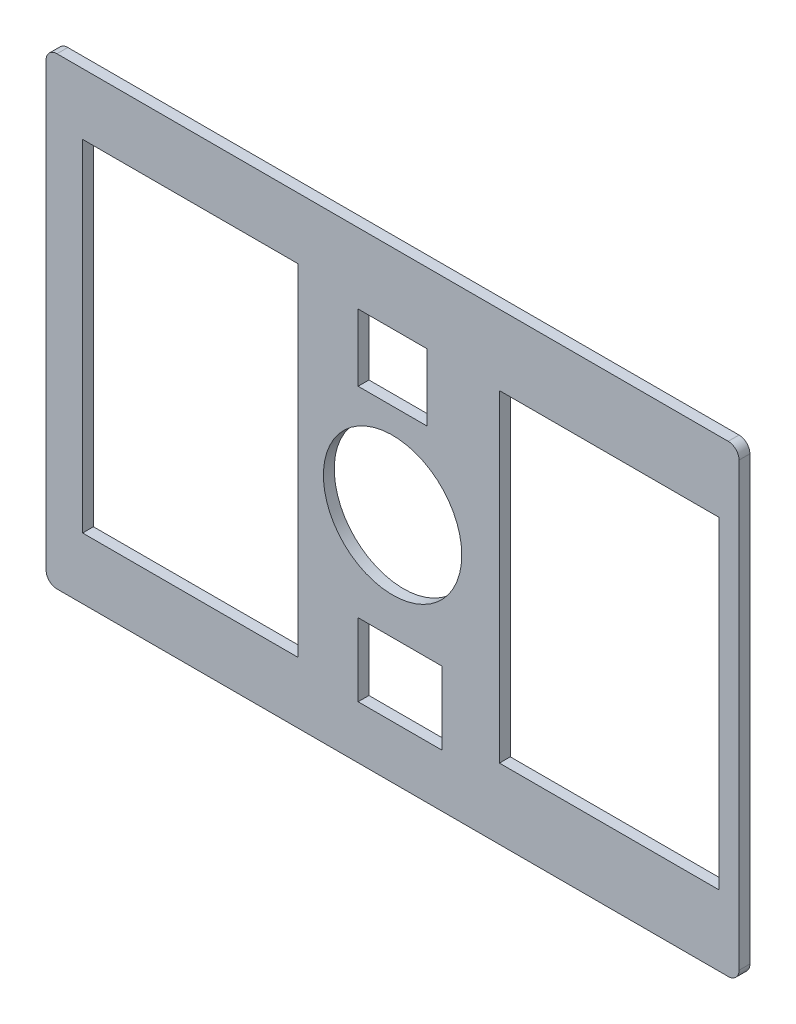
ISO-10303-21;
HEADER;
FILE_DESCRIPTION(('STEP AP214'),'2;1');
FILE_NAME('part.step','',(''),(''),'','','');
FILE_SCHEMA(('AUTOMOTIVE_DESIGN { 1 0 10303 214 1 1 1 1 }'));
ENDSEC;
DATA;
#1=APPLICATION_CONTEXT('core data for automotive mechanical design processes');
#2=APPLICATION_PROTOCOL_DEFINITION('international standard','automotive_design',2000,#1);
#3=PRODUCT_CONTEXT('',#1,'mechanical');
#4=PRODUCT('Part','Part','',(#3));
#5=PRODUCT_RELATED_PRODUCT_CATEGORY('part','',(#4));
#6=PRODUCT_DEFINITION_FORMATION('','',#4);
#7=PRODUCT_DEFINITION_CONTEXT('part definition',#1,'design');
#8=PRODUCT_DEFINITION('design','',#6,#7);
#9=PRODUCT_DEFINITION_SHAPE('','',#8);
#10=(LENGTH_UNIT() NAMED_UNIT(*) SI_UNIT(.MILLI.,.METRE.));
#11=(NAMED_UNIT(*) PLANE_ANGLE_UNIT() SI_UNIT($,.RADIAN.));
#12=(NAMED_UNIT(*) SI_UNIT($,.STERADIAN.) SOLID_ANGLE_UNIT());
#13=UNCERTAINTY_MEASURE_WITH_UNIT(LENGTH_MEASURE(1.E-05),#10,'distance_accuracy_value','');
#14=(GEOMETRIC_REPRESENTATION_CONTEXT(3) GLOBAL_UNCERTAINTY_ASSIGNED_CONTEXT((#13)) GLOBAL_UNIT_ASSIGNED_CONTEXT((#10,
#11,#12)) REPRESENTATION_CONTEXT('',''));
#15=CARTESIAN_POINT('',(0.,0.,0.));
#16=DIRECTION('',(0.,0.,1.));
#17=DIRECTION('',(1.,0.,0.));
#18=AXIS2_PLACEMENT_3D('',#15,#16,#17);
#19=CARTESIAN_POINT('',(-61.855,40.715,2.));
#20=DIRECTION('',(0.,0.,-1.));
#21=DIRECTION('',(-1.,0.,0.));
#22=AXIS2_PLACEMENT_3D('',#19,#20,#21);
#23=PLANE('',#22);
#24=DIRECTION('',(0.,-1.,0.));
#25=VECTOR('',#24,1.);
#26=CARTESIAN_POINT('',(-6.34975521554568,17.3943510106581,2.));
#27=LINE('',#26,#25);
#28=CARTESIAN_POINT('',(-6.34975521554568,29.7289235600392,2.));
#29=VERTEX_POINT('',#28);
#30=CARTESIAN_POINT('',(-6.34975521554568,17.3943510106581,2.));
#31=VERTEX_POINT('',#30);
#32=EDGE_CURVE('E230',#29,#31,#27,.T.);
#33=ORIENTED_EDGE('',*,*,#32,.F.);
#34=DIRECTION('',(-1.,0.,0.));
#35=VECTOR('',#34,1.);
#36=CARTESIAN_POINT('',(6.34975521554568,29.7289235600392,2.));
#37=LINE('',#36,#35);
#38=CARTESIAN_POINT('',(6.34975521554568,29.7289235600392,2.));
#39=VERTEX_POINT('',#38);
#40=EDGE_CURVE('E238',#39,#29,#37,.T.);
#41=ORIENTED_EDGE('',*,*,#40,.F.);
#42=DIRECTION('',(0.,1.,0.));
#43=VECTOR('',#42,1.);
#44=CARTESIAN_POINT('',(6.34975521554568,17.3943510106581,2.));
#45=LINE('',#44,#43);
#46=CARTESIAN_POINT('',(6.34975521554568,17.3943510106581,2.));
#47=VERTEX_POINT('',#46);
#48=EDGE_CURVE('E235',#47,#39,#45,.T.);
#49=ORIENTED_EDGE('',*,*,#48,.F.);
#50=DIRECTION('',(1.,0.,0.));
#51=VECTOR('',#50,1.);
#52=CARTESIAN_POINT('',(6.34975521554568,17.3943510106581,2.));
#53=LINE('',#52,#51);
#54=EDGE_CURVE('E232',#31,#47,#53,.T.);
#55=ORIENTED_EDGE('',*,*,#54,.F.);
#56=EDGE_LOOP('',(#33,#41,#49,#55));
#57=FACE_BOUND('',#56,.T.);
#58=DIRECTION('',(0.,-1.,0.));
#59=VECTOR('',#58,1.);
#60=CARTESIAN_POINT('',(-57.1289742230204,-31.4153182872247,2.));
#61=LINE('',#60,#59);
#62=CARTESIAN_POINT('',(-57.1289742230204,31.4153182872247,2.));
#63=VERTEX_POINT('',#62);
#64=CARTESIAN_POINT('',(-57.1289742230204,-31.4153182872247,2.));
#65=VERTEX_POINT('',#64);
#66=EDGE_CURVE('E292',#63,#65,#61,.T.);
#67=ORIENTED_EDGE('',*,*,#66,.F.);
#68=DIRECTION('',(-1.,0.,0.));
#69=VECTOR('',#68,1.);
#70=CARTESIAN_POINT('',(-17.4050095382062,31.4153182872247,2.));
#71=LINE('',#70,#69);
#72=CARTESIAN_POINT('',(-17.4050095382062,31.4153182872247,2.));
#73=VERTEX_POINT('',#72);
#74=EDGE_CURVE('E300',#73,#63,#71,.T.);
#75=ORIENTED_EDGE('',*,*,#74,.F.);
#76=DIRECTION('',(0.,1.,0.));
#77=VECTOR('',#76,1.);
#78=CARTESIAN_POINT('',(-17.4050095382062,-31.4153182872247,2.));
#79=LINE('',#78,#77);
#80=CARTESIAN_POINT('',(-17.4050095382062,-31.4153182872247,2.));
#81=VERTEX_POINT('',#80);
#82=EDGE_CURVE('E297',#81,#73,#79,.T.);
#83=ORIENTED_EDGE('',*,*,#82,.F.);
#84=DIRECTION('',(1.,0.,0.));
#85=VECTOR('',#84,1.);
#86=CARTESIAN_POINT('',(-17.4050095382062,-31.4153182872247,2.));
#87=LINE('',#86,#85);
#88=EDGE_CURVE('E294',#65,#81,#87,.T.);
#89=ORIENTED_EDGE('',*,*,#88,.F.);
#90=EDGE_LOOP('',(#67,#75,#83,#89));
#91=FACE_BOUND('',#90,.T.);
#92=CARTESIAN_POINT('',(-61.855,40.715,2.));
#93=DIRECTION('',(0.,0.,1.));
#94=DIRECTION('',(-1.,0.,0.));
#95=AXIS2_PLACEMENT_3D('',#92,#93,#94);
#96=CIRCLE('',#95,2.);
#97=CARTESIAN_POINT('',(-61.855,42.715,2.));
#98=VERTEX_POINT('',#97);
#99=CARTESIAN_POINT('',(-63.855,40.715,2.));
#100=VERTEX_POINT('',#99);
#101=EDGE_CURVE('E329',#98,#100,#96,.T.);
#102=ORIENTED_EDGE('',*,*,#101,.T.);
#103=DIRECTION('',(0.,-1.,0.));
#104=VECTOR('',#103,1.);
#105=CARTESIAN_POINT('',(-63.855,-40.715,2.));
#106=LINE('',#105,#104);
#107=CARTESIAN_POINT('',(-63.855,-40.715,2.));
#108=VERTEX_POINT('',#107);
#109=EDGE_CURVE('E332',#100,#108,#106,.T.);
#110=ORIENTED_EDGE('',*,*,#109,.T.);
#111=CARTESIAN_POINT('',(-61.855,-40.715,2.));
#112=DIRECTION('',(0.,0.,1.));
#113=DIRECTION('',(-1.,0.,0.));
#114=AXIS2_PLACEMENT_3D('',#111,#112,#113);
#115=CIRCLE('',#114,2.);
#116=CARTESIAN_POINT('',(-61.855,-42.715,2.));
#117=VERTEX_POINT('',#116);
#118=EDGE_CURVE('E335',#108,#117,#115,.T.);
#119=ORIENTED_EDGE('',*,*,#118,.T.);
#120=DIRECTION('',(1.,0.,0.));
#121=VECTOR('',#120,1.);
#122=CARTESIAN_POINT('',(61.855,-42.715,2.));
#123=LINE('',#122,#121);
#124=CARTESIAN_POINT('',(61.855,-42.715,2.));
#125=VERTEX_POINT('',#124);
#126=EDGE_CURVE('E337',#117,#125,#123,.T.);
#127=ORIENTED_EDGE('',*,*,#126,.T.);
#128=CARTESIAN_POINT('',(61.855,-40.715,2.));
#129=DIRECTION('',(0.,0.,1.));
#130=DIRECTION('',(1.,0.,0.));
#131=AXIS2_PLACEMENT_3D('',#128,#129,#130);
#132=CIRCLE('',#131,2.);
#133=CARTESIAN_POINT('',(63.855,-40.715,2.));
#134=VERTEX_POINT('',#133);
#135=EDGE_CURVE('E339',#125,#134,#132,.T.);
#136=ORIENTED_EDGE('',*,*,#135,.T.);
#137=DIRECTION('',(0.,1.,0.));
#138=VECTOR('',#137,1.);
#139=CARTESIAN_POINT('',(63.855,-40.715,2.));
#140=LINE('',#139,#138);
#141=CARTESIAN_POINT('',(63.855,40.715,2.));
#142=VERTEX_POINT('',#141);
#143=EDGE_CURVE('E341',#134,#142,#140,.T.);
#144=ORIENTED_EDGE('',*,*,#143,.T.);
#145=CARTESIAN_POINT('',(61.855,40.715,2.));
#146=DIRECTION('',(0.,0.,1.));
#147=DIRECTION('',(1.,0.,0.));
#148=AXIS2_PLACEMENT_3D('',#145,#146,#147);
#149=CIRCLE('',#148,2.);
#150=CARTESIAN_POINT('',(61.855,42.715,2.));
#151=VERTEX_POINT('',#150);
#152=EDGE_CURVE('E343',#142,#151,#149,.T.);
#153=ORIENTED_EDGE('',*,*,#152,.T.);
#154=DIRECTION('',(-1.,0.,0.));
#155=VECTOR('',#154,1.);
#156=CARTESIAN_POINT('',(61.855,42.715,2.));
#157=LINE('',#156,#155);
#158=EDGE_CURVE('E345',#151,#98,#157,.T.);
#159=ORIENTED_EDGE('',*,*,#158,.T.);
#160=EDGE_LOOP('',(#102,#110,#119,#127,#136,#144,#153,#159));
#161=FACE_BOUND('',#160,.T.);
#162=CARTESIAN_POINT('',(0.,0.,2.));
#163=DIRECTION('',(0.,0.,1.));
#164=DIRECTION('',(1.,0.,0.));
#165=AXIS2_PLACEMENT_3D('',#162,#163,#164);
#166=CIRCLE('',#165,12.75);
#167=CARTESIAN_POINT('',(12.75,0.,2.));
#168=VERTEX_POINT('',#167);
#169=EDGE_CURVE('E323',#168,#168,#166,.T.);
#170=ORIENTED_EDGE('',*,*,#169,.F.);
#171=EDGE_LOOP('',(#170));
#172=FACE_BOUND('',#171,.T.);
#173=DIRECTION('',(0.,-1.,0.));
#174=VECTOR('',#173,1.);
#175=CARTESIAN_POINT('',(19.6956744598749,-29.7289235600393,2.));
#176=LINE('',#175,#174);
#177=CARTESIAN_POINT('',(19.6956744598749,29.7289235600392,2.));
#178=VERTEX_POINT('',#177);
#179=CARTESIAN_POINT('',(19.6956744598749,-29.7289235600393,2.));
#180=VERTEX_POINT('',#179);
#181=EDGE_CURVE('E261',#178,#180,#176,.T.);
#182=ORIENTED_EDGE('',*,*,#181,.F.);
#183=DIRECTION('',(-1.,0.,0.));
#184=VECTOR('',#183,1.);
#185=CARTESIAN_POINT('',(60.1691479123272,29.7289235600392,2.));
#186=LINE('',#185,#184);
#187=CARTESIAN_POINT('',(60.1691479123272,29.7289235600392,2.));
#188=VERTEX_POINT('',#187);
#189=EDGE_CURVE('E269',#188,#178,#186,.T.);
#190=ORIENTED_EDGE('',*,*,#189,.F.);
#191=DIRECTION('',(0.,1.,0.));
#192=VECTOR('',#191,1.);
#193=CARTESIAN_POINT('',(60.1691479123272,-29.7289235600393,2.));
#194=LINE('',#193,#192);
#195=CARTESIAN_POINT('',(60.1691479123272,-29.7289235600393,2.));
#196=VERTEX_POINT('',#195);
#197=EDGE_CURVE('E266',#196,#188,#194,.T.);
#198=ORIENTED_EDGE('',*,*,#197,.F.);
#199=DIRECTION('',(1.,0.,0.));
#200=VECTOR('',#199,1.);
#201=CARTESIAN_POINT('',(60.1691479123272,-29.7289235600393,2.));
#202=LINE('',#201,#200);
#203=EDGE_CURVE('E263',#180,#196,#202,.T.);
#204=ORIENTED_EDGE('',*,*,#203,.F.);
#205=EDGE_LOOP('',(#182,#190,#198,#204));
#206=FACE_BOUND('',#205,.T.);
#207=DIRECTION('',(0.,-1.,0.));
#208=VECTOR('',#207,1.);
#209=CARTESIAN_POINT('',(-6.34975521554568,-32.9613141754538,2.));
#210=LINE('',#209,#208);
#211=CARTESIAN_POINT('',(-6.34975521554568,-19.5470758278872,2.));
#212=VERTEX_POINT('',#211);
#213=CARTESIAN_POINT('',(-6.34975521554568,-32.9613141754538,2.));
#214=VERTEX_POINT('',#213);
#215=EDGE_CURVE('E194',#212,#214,#210,.T.);
#216=ORIENTED_EDGE('',*,*,#215,.F.);
#217=DIRECTION('',(-1.,0.,0.));
#218=VECTOR('',#217,1.);
#219=CARTESIAN_POINT('',(9.07674979523479,-19.5470758278872,2.));
#220=LINE('',#219,#218);
#221=CARTESIAN_POINT('',(9.07674979523479,-19.5470758278872,2.));
#222=VERTEX_POINT('',#221);
#223=EDGE_CURVE('E216',#222,#212,#220,.T.);
#224=ORIENTED_EDGE('',*,*,#223,.F.);
#225=DIRECTION('',(0.,1.,0.));
#226=VECTOR('',#225,1.);
#227=CARTESIAN_POINT('',(9.07674979523479,-32.9613141754538,2.));
#228=LINE('',#227,#226);
#229=CARTESIAN_POINT('',(9.07674979523479,-32.9613141754538,2.));
#230=VERTEX_POINT('',#229);
#231=EDGE_CURVE('E214',#230,#222,#228,.T.);
#232=ORIENTED_EDGE('',*,*,#231,.F.);
#233=DIRECTION('',(1.,0.,0.));
#234=VECTOR('',#233,1.);
#235=CARTESIAN_POINT('',(9.07674979523479,-32.9613141754538,2.));
#236=LINE('',#235,#234);
#237=EDGE_CURVE('E202',#214,#230,#236,.T.);
#238=ORIENTED_EDGE('',*,*,#237,.F.);
#239=EDGE_LOOP('',(#216,#224,#232,#238));
#240=FACE_BOUND('',#239,.T.);
#241=ADVANCED_FACE('F33',(#57,#91,#161,#172,#206,#240),#23,.F.);
#242=CARTESIAN_POINT('',(-61.855,40.715,0.));
#243=DIRECTION('',(0.,0.,-1.));
#244=DIRECTION('',(-1.,0.,0.));
#245=AXIS2_PLACEMENT_3D('',#242,#243,#244);
#246=PLANE('',#245);
#247=CARTESIAN_POINT('',(-61.855,40.715,0.));
#248=DIRECTION('',(0.,0.,1.));
#249=DIRECTION('',(-1.,0.,0.));
#250=AXIS2_PLACEMENT_3D('',#247,#248,#249);
#251=CIRCLE('',#250,2.);
#252=CARTESIAN_POINT('',(-61.855,42.715,0.));
#253=VERTEX_POINT('',#252);
#254=CARTESIAN_POINT('',(-63.855,40.715,0.));
#255=VERTEX_POINT('',#254);
#256=EDGE_CURVE('E326',#253,#255,#251,.T.);
#257=ORIENTED_EDGE('',*,*,#256,.F.);
#258=DIRECTION('',(-1.,0.,0.));
#259=VECTOR('',#258,1.);
#260=CARTESIAN_POINT('',(61.855,42.715,0.));
#261=LINE('',#260,#259);
#262=CARTESIAN_POINT('',(61.855,42.715,0.));
#263=VERTEX_POINT('',#262);
#264=EDGE_CURVE('E333',#263,#253,#261,.T.);
#265=ORIENTED_EDGE('',*,*,#264,.F.);
#266=CARTESIAN_POINT('',(61.855,40.715,0.));
#267=DIRECTION('',(0.,0.,1.));
#268=DIRECTION('',(1.,0.,0.));
#269=AXIS2_PLACEMENT_3D('',#266,#267,#268);
#270=CIRCLE('',#269,2.);
#271=CARTESIAN_POINT('',(63.855,40.715,0.));
#272=VERTEX_POINT('',#271);
#273=EDGE_CURVE('E360',#272,#263,#270,.T.);
#274=ORIENTED_EDGE('',*,*,#273,.F.);
#275=DIRECTION('',(0.,1.,0.));
#276=VECTOR('',#275,1.);
#277=CARTESIAN_POINT('',(63.855,-40.715,0.));
#278=LINE('',#277,#276);
#279=CARTESIAN_POINT('',(63.855,-40.715,0.));
#280=VERTEX_POINT('',#279);
#281=EDGE_CURVE('E358',#280,#272,#278,.T.);
#282=ORIENTED_EDGE('',*,*,#281,.F.);
#283=CARTESIAN_POINT('',(61.855,-40.715,0.));
#284=DIRECTION('',(0.,0.,1.));
#285=DIRECTION('',(1.,0.,0.));
#286=AXIS2_PLACEMENT_3D('',#283,#284,#285);
#287=CIRCLE('',#286,2.);
#288=CARTESIAN_POINT('',(61.855,-42.715,0.));
#289=VERTEX_POINT('',#288);
#290=EDGE_CURVE('E356',#289,#280,#287,.T.);
#291=ORIENTED_EDGE('',*,*,#290,.F.);
#292=DIRECTION('',(1.,0.,0.));
#293=VECTOR('',#292,1.);
#294=CARTESIAN_POINT('',(61.855,-42.715,0.));
#295=LINE('',#294,#293);
#296=CARTESIAN_POINT('',(-61.855,-42.715,0.));
#297=VERTEX_POINT('',#296);
#298=EDGE_CURVE('E354',#297,#289,#295,.T.);
#299=ORIENTED_EDGE('',*,*,#298,.F.);
#300=CARTESIAN_POINT('',(-61.855,-40.715,0.));
#301=DIRECTION('',(0.,0.,1.));
#302=DIRECTION('',(-1.,0.,0.));
#303=AXIS2_PLACEMENT_3D('',#300,#301,#302);
#304=CIRCLE('',#303,2.);
#305=CARTESIAN_POINT('',(-63.855,-40.715,0.));
#306=VERTEX_POINT('',#305);
#307=EDGE_CURVE('E352',#306,#297,#304,.T.);
#308=ORIENTED_EDGE('',*,*,#307,.F.);
#309=DIRECTION('',(0.,-1.,0.));
#310=VECTOR('',#309,1.);
#311=CARTESIAN_POINT('',(-63.855,-40.715,0.));
#312=LINE('',#311,#310);
#313=EDGE_CURVE('E350',#255,#306,#312,.T.);
#314=ORIENTED_EDGE('',*,*,#313,.F.);
#315=EDGE_LOOP('',(#257,#265,#274,#282,#291,#299,#308,#314));
#316=FACE_BOUND('',#315,.T.);
#317=CARTESIAN_POINT('',(0.,0.,0.));
#318=DIRECTION('',(0.,0.,1.));
#319=DIRECTION('',(1.,0.,0.));
#320=AXIS2_PLACEMENT_3D('',#317,#318,#319);
#321=CIRCLE('',#320,12.75);
#322=CARTESIAN_POINT('',(12.75,0.,0.));
#323=VERTEX_POINT('',#322);
#324=EDGE_CURVE('E322',#323,#323,#321,.T.);
#325=ORIENTED_EDGE('',*,*,#324,.T.);
#326=EDGE_LOOP('',(#325));
#327=FACE_BOUND('',#326,.T.);
#328=DIRECTION('',(-1.,0.,0.));
#329=VECTOR('',#328,1.);
#330=CARTESIAN_POINT('',(-17.4050095382062,31.4153182872247,0.));
#331=LINE('',#330,#329);
#332=CARTESIAN_POINT('',(-17.4050095382062,31.4153182872247,0.));
#333=VERTEX_POINT('',#332);
#334=CARTESIAN_POINT('',(-57.1289742230204,31.4153182872247,0.));
#335=VERTEX_POINT('',#334);
#336=EDGE_CURVE('E295',#333,#335,#331,.T.);
#337=ORIENTED_EDGE('',*,*,#336,.T.);
#338=DIRECTION('',(0.,-1.,0.));
#339=VECTOR('',#338,1.);
#340=CARTESIAN_POINT('',(-57.1289742230204,-31.4153182872247,0.));
#341=LINE('',#340,#339);
#342=CARTESIAN_POINT('',(-57.1289742230204,-31.4153182872247,0.));
#343=VERTEX_POINT('',#342);
#344=EDGE_CURVE('E291',#335,#343,#341,.T.);
#345=ORIENTED_EDGE('',*,*,#344,.T.);
#346=DIRECTION('',(1.,0.,0.));
#347=VECTOR('',#346,1.);
#348=CARTESIAN_POINT('',(-17.4050095382062,-31.4153182872247,0.));
#349=LINE('',#348,#347);
#350=CARTESIAN_POINT('',(-17.4050095382062,-31.4153182872247,0.));
#351=VERTEX_POINT('',#350);
#352=EDGE_CURVE('E305',#343,#351,#349,.T.);
#353=ORIENTED_EDGE('',*,*,#352,.T.);
#354=DIRECTION('',(0.,1.,0.));
#355=VECTOR('',#354,1.);
#356=CARTESIAN_POINT('',(-17.4050095382062,-31.4153182872247,0.));
#357=LINE('',#356,#355);
#358=EDGE_CURVE('E308',#351,#333,#357,.T.);
#359=ORIENTED_EDGE('',*,*,#358,.T.);
#360=EDGE_LOOP('',(#337,#345,#353,#359));
#361=FACE_BOUND('',#360,.T.);
#362=DIRECTION('',(-1.,0.,0.));
#363=VECTOR('',#362,1.);
#364=CARTESIAN_POINT('',(60.1691479123272,29.7289235600392,0.));
#365=LINE('',#364,#363);
#366=CARTESIAN_POINT('',(60.1691479123272,29.7289235600392,0.));
#367=VERTEX_POINT('',#366);
#368=CARTESIAN_POINT('',(19.6956744598749,29.7289235600392,0.));
#369=VERTEX_POINT('',#368);
#370=EDGE_CURVE('E264',#367,#369,#365,.T.);
#371=ORIENTED_EDGE('',*,*,#370,.T.);
#372=DIRECTION('',(0.,-1.,0.));
#373=VECTOR('',#372,1.);
#374=CARTESIAN_POINT('',(19.6956744598749,-29.7289235600393,0.));
#375=LINE('',#374,#373);
#376=CARTESIAN_POINT('',(19.6956744598749,-29.7289235600393,0.));
#377=VERTEX_POINT('',#376);
#378=EDGE_CURVE('E260',#369,#377,#375,.T.);
#379=ORIENTED_EDGE('',*,*,#378,.T.);
#380=DIRECTION('',(1.,0.,0.));
#381=VECTOR('',#380,1.);
#382=CARTESIAN_POINT('',(60.1691479123272,-29.7289235600393,0.));
#383=LINE('',#382,#381);
#384=CARTESIAN_POINT('',(60.1691479123272,-29.7289235600393,0.));
#385=VERTEX_POINT('',#384);
#386=EDGE_CURVE('E274',#377,#385,#383,.T.);
#387=ORIENTED_EDGE('',*,*,#386,.T.);
#388=DIRECTION('',(0.,1.,0.));
#389=VECTOR('',#388,1.);
#390=CARTESIAN_POINT('',(60.1691479123272,-29.7289235600393,0.));
#391=LINE('',#390,#389);
#392=EDGE_CURVE('E277',#385,#367,#391,.T.);
#393=ORIENTED_EDGE('',*,*,#392,.T.);
#394=EDGE_LOOP('',(#371,#379,#387,#393));
#395=FACE_BOUND('',#394,.T.);
#396=DIRECTION('',(-1.,0.,0.));
#397=VECTOR('',#396,1.);
#398=CARTESIAN_POINT('',(6.34975521554568,29.7289235600392,0.));
#399=LINE('',#398,#397);
#400=CARTESIAN_POINT('',(6.34975521554568,29.7289235600392,0.));
#401=VERTEX_POINT('',#400);
#402=CARTESIAN_POINT('',(-6.34975521554568,29.7289235600392,0.));
#403=VERTEX_POINT('',#402);
#404=EDGE_CURVE('E233',#401,#403,#399,.T.);
#405=ORIENTED_EDGE('',*,*,#404,.T.);
#406=DIRECTION('',(0.,-1.,0.));
#407=VECTOR('',#406,1.);
#408=CARTESIAN_POINT('',(-6.34975521554568,17.3943510106581,0.));
#409=LINE('',#408,#407);
#410=CARTESIAN_POINT('',(-6.34975521554568,17.3943510106581,0.));
#411=VERTEX_POINT('',#410);
#412=EDGE_CURVE('E210',#403,#411,#409,.T.);
#413=ORIENTED_EDGE('',*,*,#412,.T.);
#414=DIRECTION('',(1.,0.,0.));
#415=VECTOR('',#414,1.);
#416=CARTESIAN_POINT('',(6.34975521554568,17.3943510106581,0.));
#417=LINE('',#416,#415);
#418=CARTESIAN_POINT('',(6.34975521554568,17.3943510106581,0.));
#419=VERTEX_POINT('',#418);
#420=EDGE_CURVE('E243',#411,#419,#417,.T.);
#421=ORIENTED_EDGE('',*,*,#420,.T.);
#422=DIRECTION('',(0.,1.,0.));
#423=VECTOR('',#422,1.);
#424=CARTESIAN_POINT('',(6.34975521554568,17.3943510106581,0.));
#425=LINE('',#424,#423);
#426=EDGE_CURVE('E246',#419,#401,#425,.T.);
#427=ORIENTED_EDGE('',*,*,#426,.T.);
#428=EDGE_LOOP('',(#405,#413,#421,#427));
#429=FACE_BOUND('',#428,.T.);
#430=DIRECTION('',(-1.,0.,0.));
#431=VECTOR('',#430,1.);
#432=CARTESIAN_POINT('',(9.07674979523479,-19.5470758278872,0.));
#433=LINE('',#432,#431);
#434=CARTESIAN_POINT('',(9.07674979523479,-19.5470758278872,0.));
#435=VERTEX_POINT('',#434);
#436=CARTESIAN_POINT('',(-6.34975521554568,-19.5470758278872,0.));
#437=VERTEX_POINT('',#436);
#438=EDGE_CURVE('E203',#435,#437,#433,.T.);
#439=ORIENTED_EDGE('',*,*,#438,.T.);
#440=DIRECTION('',(0.,-1.,0.));
#441=VECTOR('',#440,1.);
#442=CARTESIAN_POINT('',(-6.34975521554568,-32.9613141754538,0.));
#443=LINE('',#442,#441);
#444=CARTESIAN_POINT('',(-6.34975521554568,-32.9613141754538,0.));
#445=VERTEX_POINT('',#444);
#446=EDGE_CURVE('E56',#437,#445,#443,.T.);
#447=ORIENTED_EDGE('',*,*,#446,.T.);
#448=DIRECTION('',(1.,0.,0.));
#449=VECTOR('',#448,1.);
#450=CARTESIAN_POINT('',(9.07674979523479,-32.9613141754538,0.));
#451=LINE('',#450,#449);
#452=CARTESIAN_POINT('',(9.07674979523479,-32.9613141754538,0.));
#453=VERTEX_POINT('',#452);
#454=EDGE_CURVE('E209',#445,#453,#451,.T.);
#455=ORIENTED_EDGE('',*,*,#454,.T.);
#456=DIRECTION('',(0.,1.,0.));
#457=VECTOR('',#456,1.);
#458=CARTESIAN_POINT('',(9.07674979523479,-32.9613141754538,0.));
#459=LINE('',#458,#457);
#460=EDGE_CURVE('E222',#453,#435,#459,.T.);
#461=ORIENTED_EDGE('',*,*,#460,.T.);
#462=EDGE_LOOP('',(#439,#447,#455,#461));
#463=FACE_BOUND('',#462,.T.);
#464=ADVANCED_FACE('F390',(#316,#327,#361,#395,#429,#463),#246,.T.);
#465=CARTESIAN_POINT('',(-61.855,40.715,2.));
#466=DIRECTION('',(0.,0.,-1.));
#467=DIRECTION('',(-1.,0.,0.));
#468=AXIS2_PLACEMENT_3D('',#465,#466,#467);
#469=CYLINDRICAL_SURFACE('',#468,2.);
#470=ORIENTED_EDGE('',*,*,#256,.T.);
#471=DIRECTION('',(0.,0.,-1.));
#472=VECTOR('',#471,1.);
#473=CARTESIAN_POINT('',(-63.855,40.715,2.));
#474=LINE('',#473,#472);
#475=EDGE_CURVE('E11',#100,#255,#474,.T.);
#476=ORIENTED_EDGE('',*,*,#475,.F.);
#477=ORIENTED_EDGE('',*,*,#101,.F.);
#478=DIRECTION('',(0.,0.,-1.));
#479=VECTOR('',#478,1.);
#480=CARTESIAN_POINT('',(-61.855,42.715,2.));
#481=LINE('',#480,#479);
#482=EDGE_CURVE('E347',#98,#253,#481,.T.);
#483=ORIENTED_EDGE('',*,*,#482,.T.);
#484=EDGE_LOOP('',(#470,#476,#477,#483));
#485=FACE_BOUND('',#484,.T.);
#486=ADVANCED_FACE('F35',(#485),#469,.T.);
#487=CARTESIAN_POINT('',(-63.855,-40.715,2.));
#488=DIRECTION('',(1.,0.,0.));
#489=DIRECTION('',(0.,0.,-1.));
#490=AXIS2_PLACEMENT_3D('',#487,#488,#489);
#491=PLANE('',#490);
#492=ORIENTED_EDGE('',*,*,#313,.T.);
#493=DIRECTION('',(0.,0.,-1.));
#494=VECTOR('',#493,1.);
#495=CARTESIAN_POINT('',(-63.855,-40.715,2.));
#496=LINE('',#495,#494);
#497=EDGE_CURVE('E41',#108,#306,#496,.T.);
#498=ORIENTED_EDGE('',*,*,#497,.F.);
#499=ORIENTED_EDGE('',*,*,#109,.F.);
#500=ORIENTED_EDGE('',*,*,#475,.T.);
#501=EDGE_LOOP('',(#492,#498,#499,#500));
#502=FACE_BOUND('',#501,.T.);
#503=ADVANCED_FACE('F408',(#502),#491,.F.);
#504=CARTESIAN_POINT('',(-61.855,-40.715,2.));
#505=DIRECTION('',(0.,0.,-1.));
#506=DIRECTION('',(-1.,0.,0.));
#507=AXIS2_PLACEMENT_3D('',#504,#505,#506);
#508=CYLINDRICAL_SURFACE('',#507,2.);
#509=ORIENTED_EDGE('',*,*,#307,.T.);
#510=DIRECTION('',(0.,0.,-1.));
#511=VECTOR('',#510,1.);
#512=CARTESIAN_POINT('',(-61.855,-42.715,2.));
#513=LINE('',#512,#511);
#514=EDGE_CURVE('E377',#117,#297,#513,.T.);
#515=ORIENTED_EDGE('',*,*,#514,.F.);
#516=ORIENTED_EDGE('',*,*,#118,.F.);
#517=ORIENTED_EDGE('',*,*,#497,.T.);
#518=EDGE_LOOP('',(#509,#515,#516,#517));
#519=FACE_BOUND('',#518,.T.);
#520=ADVANCED_FACE('F384',(#519),#508,.T.);
#521=CARTESIAN_POINT('',(61.855,-42.715,2.));
#522=DIRECTION('',(0.,1.,0.));
#523=DIRECTION('',(0.,0.,1.));
#524=AXIS2_PLACEMENT_3D('',#521,#522,#523);
#525=PLANE('',#524);
#526=ORIENTED_EDGE('',*,*,#298,.T.);
#527=DIRECTION('',(0.,0.,-1.));
#528=VECTOR('',#527,1.);
#529=CARTESIAN_POINT('',(61.855,-42.715,2.));
#530=LINE('',#529,#528);
#531=EDGE_CURVE('E374',#125,#289,#530,.T.);
#532=ORIENTED_EDGE('',*,*,#531,.F.);
#533=ORIENTED_EDGE('',*,*,#126,.F.);
#534=ORIENTED_EDGE('',*,*,#514,.T.);
#535=EDGE_LOOP('',(#526,#532,#533,#534));
#536=FACE_BOUND('',#535,.T.);
#537=ADVANCED_FACE('F396',(#536),#525,.F.);
#538=CARTESIAN_POINT('',(61.855,-40.715,2.));
#539=DIRECTION('',(0.,0.,-1.));
#540=DIRECTION('',(-1.,0.,0.));
#541=AXIS2_PLACEMENT_3D('',#538,#539,#540);
#542=CYLINDRICAL_SURFACE('',#541,2.);
#543=ORIENTED_EDGE('',*,*,#290,.T.);
#544=DIRECTION('',(0.,0.,-1.));
#545=VECTOR('',#544,1.);
#546=CARTESIAN_POINT('',(63.855,-40.715,2.));
#547=LINE('',#546,#545);
#548=EDGE_CURVE('E371',#134,#280,#547,.T.);
#549=ORIENTED_EDGE('',*,*,#548,.F.);
#550=ORIENTED_EDGE('',*,*,#135,.F.);
#551=ORIENTED_EDGE('',*,*,#531,.T.);
#552=EDGE_LOOP('',(#543,#549,#550,#551));
#553=FACE_BOUND('',#552,.T.);
#554=ADVANCED_FACE('F400',(#553),#542,.T.);
#555=CARTESIAN_POINT('',(63.855,-40.715,2.));
#556=DIRECTION('',(-1.,0.,0.));
#557=DIRECTION('',(0.,0.,1.));
#558=AXIS2_PLACEMENT_3D('',#555,#556,#557);
#559=PLANE('',#558);
#560=ORIENTED_EDGE('',*,*,#281,.T.);
#561=DIRECTION('',(0.,0.,-1.));
#562=VECTOR('',#561,1.);
#563=CARTESIAN_POINT('',(63.855,40.715,2.));
#564=LINE('',#563,#562);
#565=EDGE_CURVE('E368',#142,#272,#564,.T.);
#566=ORIENTED_EDGE('',*,*,#565,.F.);
#567=ORIENTED_EDGE('',*,*,#143,.F.);
#568=ORIENTED_EDGE('',*,*,#548,.T.);
#569=EDGE_LOOP('',(#560,#566,#567,#568));
#570=FACE_BOUND('',#569,.T.);
#571=ADVANCED_FACE('F421',(#570),#559,.F.);
#572=CARTESIAN_POINT('',(61.855,40.715,2.));
#573=DIRECTION('',(0.,0.,-1.));
#574=DIRECTION('',(-1.,0.,0.));
#575=AXIS2_PLACEMENT_3D('',#572,#573,#574);
#576=CYLINDRICAL_SURFACE('',#575,2.);
#577=ORIENTED_EDGE('',*,*,#273,.T.);
#578=DIRECTION('',(0.,0.,-1.));
#579=VECTOR('',#578,1.);
#580=CARTESIAN_POINT('',(61.855,42.715,2.));
#581=LINE('',#580,#579);
#582=EDGE_CURVE('E365',#151,#263,#581,.T.);
#583=ORIENTED_EDGE('',*,*,#582,.F.);
#584=ORIENTED_EDGE('',*,*,#152,.F.);
#585=ORIENTED_EDGE('',*,*,#565,.T.);
#586=EDGE_LOOP('',(#577,#583,#584,#585));
#587=FACE_BOUND('',#586,.T.);
#588=ADVANCED_FACE('F419',(#587),#576,.T.);
#589=CARTESIAN_POINT('',(61.855,42.715,2.));
#590=DIRECTION('',(0.,-1.,0.));
#591=DIRECTION('',(0.,0.,-1.));
#592=AXIS2_PLACEMENT_3D('',#589,#590,#591);
#593=PLANE('',#592);
#594=ORIENTED_EDGE('',*,*,#264,.T.);
#595=ORIENTED_EDGE('',*,*,#482,.F.);
#596=ORIENTED_EDGE('',*,*,#158,.F.);
#597=ORIENTED_EDGE('',*,*,#582,.T.);
#598=EDGE_LOOP('',(#594,#595,#596,#597));
#599=FACE_BOUND('',#598,.T.);
#600=ADVANCED_FACE('F414',(#599),#593,.F.);
#601=CARTESIAN_POINT('',(0.,0.,2.));
#602=DIRECTION('',(0.,0.,-1.));
#603=DIRECTION('',(-1.,0.,0.));
#604=AXIS2_PLACEMENT_3D('',#601,#602,#603);
#605=CYLINDRICAL_SURFACE('',#604,12.75);
#606=ORIENTED_EDGE('',*,*,#169,.T.);
#607=EDGE_LOOP('',(#606));
#608=FACE_BOUND('',#607,.T.);
#609=ORIENTED_EDGE('',*,*,#324,.F.);
#610=EDGE_LOOP('',(#609));
#611=FACE_BOUND('',#610,.T.);
#612=ADVANCED_FACE('F440',(#608,#611),#605,.F.);
#613=CARTESIAN_POINT('',(-57.1289742230204,-31.4153182872247,2.));
#614=DIRECTION('',(1.,0.,0.));
#615=DIRECTION('',(0.,0.,-1.));
#616=AXIS2_PLACEMENT_3D('',#613,#614,#615);
#617=PLANE('',#616);
#618=ORIENTED_EDGE('',*,*,#344,.F.);
#619=DIRECTION('',(0.,0.,-1.));
#620=VECTOR('',#619,1.);
#621=CARTESIAN_POINT('',(-57.1289742230204,31.4153182872247,2.));
#622=LINE('',#621,#620);
#623=EDGE_CURVE('E302',#63,#335,#622,.T.);
#624=ORIENTED_EDGE('',*,*,#623,.F.);
#625=ORIENTED_EDGE('',*,*,#66,.T.);
#626=DIRECTION('',(0.,0.,-1.));
#627=VECTOR('',#626,1.);
#628=CARTESIAN_POINT('',(-57.1289742230204,-31.4153182872247,2.));
#629=LINE('',#628,#627);
#630=EDGE_CURVE('E319',#65,#343,#629,.T.);
#631=ORIENTED_EDGE('',*,*,#630,.T.);
#632=EDGE_LOOP('',(#618,#624,#625,#631));
#633=FACE_BOUND('',#632,.T.);
#634=ADVANCED_FACE('F447',(#633),#617,.T.);
#635=CARTESIAN_POINT('',(-17.4050095382062,-31.4153182872247,2.));
#636=DIRECTION('',(0.,1.,0.));
#637=DIRECTION('',(0.,0.,1.));
#638=AXIS2_PLACEMENT_3D('',#635,#636,#637);
#639=PLANE('',#638);
#640=ORIENTED_EDGE('',*,*,#352,.F.);
#641=ORIENTED_EDGE('',*,*,#630,.F.);
#642=ORIENTED_EDGE('',*,*,#88,.T.);
#643=DIRECTION('',(0.,0.,-1.));
#644=VECTOR('',#643,1.);
#645=CARTESIAN_POINT('',(-17.4050095382062,-31.4153182872247,2.));
#646=LINE('',#645,#644);
#647=EDGE_CURVE('E317',#81,#351,#646,.T.);
#648=ORIENTED_EDGE('',*,*,#647,.T.);
#649=EDGE_LOOP('',(#640,#641,#642,#648));
#650=FACE_BOUND('',#649,.T.);
#651=ADVANCED_FACE('F452',(#650),#639,.T.);
#652=CARTESIAN_POINT('',(-17.4050095382062,-31.4153182872247,2.));
#653=DIRECTION('',(-1.,0.,0.));
#654=DIRECTION('',(0.,0.,1.));
#655=AXIS2_PLACEMENT_3D('',#652,#653,#654);
#656=PLANE('',#655);
#657=ORIENTED_EDGE('',*,*,#358,.F.);
#658=ORIENTED_EDGE('',*,*,#647,.F.);
#659=ORIENTED_EDGE('',*,*,#82,.T.);
#660=DIRECTION('',(0.,0.,-1.));
#661=VECTOR('',#660,1.);
#662=CARTESIAN_POINT('',(-17.4050095382062,31.4153182872247,2.));
#663=LINE('',#662,#661);
#664=EDGE_CURVE('E315',#73,#333,#663,.T.);
#665=ORIENTED_EDGE('',*,*,#664,.T.);
#666=EDGE_LOOP('',(#657,#658,#659,#665));
#667=FACE_BOUND('',#666,.T.);
#668=ADVANCED_FACE('F514',(#667),#656,.T.);
#669=CARTESIAN_POINT('',(-17.4050095382062,31.4153182872247,2.));
#670=DIRECTION('',(0.,-1.,0.));
#671=DIRECTION('',(0.,0.,-1.));
#672=AXIS2_PLACEMENT_3D('',#669,#670,#671);
#673=PLANE('',#672);
#674=ORIENTED_EDGE('',*,*,#336,.F.);
#675=ORIENTED_EDGE('',*,*,#664,.F.);
#676=ORIENTED_EDGE('',*,*,#74,.T.);
#677=ORIENTED_EDGE('',*,*,#623,.T.);
#678=EDGE_LOOP('',(#674,#675,#676,#677));
#679=FACE_BOUND('',#678,.T.);
#680=ADVANCED_FACE('F510',(#679),#673,.T.);
#681=CARTESIAN_POINT('',(19.6956744598749,-29.7289235600393,2.));
#682=DIRECTION('',(1.,0.,0.));
#683=DIRECTION('',(0.,0.,-1.));
#684=AXIS2_PLACEMENT_3D('',#681,#682,#683);
#685=PLANE('',#684);
#686=ORIENTED_EDGE('',*,*,#378,.F.);
#687=DIRECTION('',(0.,0.,-1.));
#688=VECTOR('',#687,1.);
#689=CARTESIAN_POINT('',(19.6956744598749,29.7289235600392,2.));
#690=LINE('',#689,#688);
#691=EDGE_CURVE('E271',#178,#369,#690,.T.);
#692=ORIENTED_EDGE('',*,*,#691,.F.);
#693=ORIENTED_EDGE('',*,*,#181,.T.);
#694=DIRECTION('',(0.,0.,-1.));
#695=VECTOR('',#694,1.);
#696=CARTESIAN_POINT('',(19.6956744598749,-29.7289235600393,2.));
#697=LINE('',#696,#695);
#698=EDGE_CURVE('E288',#180,#377,#697,.T.);
#699=ORIENTED_EDGE('',*,*,#698,.T.);
#700=EDGE_LOOP('',(#686,#692,#693,#699));
#701=FACE_BOUND('',#700,.T.);
#702=ADVANCED_FACE('F506',(#701),#685,.T.);
#703=CARTESIAN_POINT('',(60.1691479123272,-29.7289235600393,2.));
#704=DIRECTION('',(0.,1.,0.));
#705=DIRECTION('',(0.,0.,1.));
#706=AXIS2_PLACEMENT_3D('',#703,#704,#705);
#707=PLANE('',#706);
#708=ORIENTED_EDGE('',*,*,#386,.F.);
#709=ORIENTED_EDGE('',*,*,#698,.F.);
#710=ORIENTED_EDGE('',*,*,#203,.T.);
#711=DIRECTION('',(0.,0.,-1.));
#712=VECTOR('',#711,1.);
#713=CARTESIAN_POINT('',(60.1691479123272,-29.7289235600393,2.));
#714=LINE('',#713,#712);
#715=EDGE_CURVE('E286',#196,#385,#714,.T.);
#716=ORIENTED_EDGE('',*,*,#715,.T.);
#717=EDGE_LOOP('',(#708,#709,#710,#716));
#718=FACE_BOUND('',#717,.T.);
#719=ADVANCED_FACE('F502',(#718),#707,.T.);
#720=CARTESIAN_POINT('',(60.1691479123272,-29.7289235600393,2.));
#721=DIRECTION('',(-1.,0.,0.));
#722=DIRECTION('',(0.,0.,1.));
#723=AXIS2_PLACEMENT_3D('',#720,#721,#722);
#724=PLANE('',#723);
#725=ORIENTED_EDGE('',*,*,#392,.F.);
#726=ORIENTED_EDGE('',*,*,#715,.F.);
#727=ORIENTED_EDGE('',*,*,#197,.T.);
#728=DIRECTION('',(0.,0.,-1.));
#729=VECTOR('',#728,1.);
#730=CARTESIAN_POINT('',(60.1691479123272,29.7289235600392,2.));
#731=LINE('',#730,#729);
#732=EDGE_CURVE('E284',#188,#367,#731,.T.);
#733=ORIENTED_EDGE('',*,*,#732,.T.);
#734=EDGE_LOOP('',(#725,#726,#727,#733));
#735=FACE_BOUND('',#734,.T.);
#736=ADVANCED_FACE('F498',(#735),#724,.T.);
#737=CARTESIAN_POINT('',(60.1691479123272,29.7289235600392,2.));
#738=DIRECTION('',(0.,-1.,0.));
#739=DIRECTION('',(0.,0.,-1.));
#740=AXIS2_PLACEMENT_3D('',#737,#738,#739);
#741=PLANE('',#740);
#742=ORIENTED_EDGE('',*,*,#370,.F.);
#743=ORIENTED_EDGE('',*,*,#732,.F.);
#744=ORIENTED_EDGE('',*,*,#189,.T.);
#745=ORIENTED_EDGE('',*,*,#691,.T.);
#746=EDGE_LOOP('',(#742,#743,#744,#745));
#747=FACE_BOUND('',#746,.T.);
#748=ADVANCED_FACE('F494',(#747),#741,.T.);
#749=CARTESIAN_POINT('',(-6.34975521554568,17.3943510106581,2.));
#750=DIRECTION('',(1.,0.,0.));
#751=DIRECTION('',(0.,0.,-1.));
#752=AXIS2_PLACEMENT_3D('',#749,#750,#751);
#753=PLANE('',#752);
#754=ORIENTED_EDGE('',*,*,#412,.F.);
#755=DIRECTION('',(0.,0.,-1.));
#756=VECTOR('',#755,1.);
#757=CARTESIAN_POINT('',(-6.34975521554568,29.7289235600392,2.));
#758=LINE('',#757,#756);
#759=EDGE_CURVE('E240',#29,#403,#758,.T.);
#760=ORIENTED_EDGE('',*,*,#759,.F.);
#761=ORIENTED_EDGE('',*,*,#32,.T.);
#762=DIRECTION('',(0.,0.,-1.));
#763=VECTOR('',#762,1.);
#764=CARTESIAN_POINT('',(-6.34975521554568,17.3943510106581,2.));
#765=LINE('',#764,#763);
#766=EDGE_CURVE('E257',#31,#411,#765,.T.);
#767=ORIENTED_EDGE('',*,*,#766,.T.);
#768=EDGE_LOOP('',(#754,#760,#761,#767));
#769=FACE_BOUND('',#768,.T.);
#770=ADVANCED_FACE('F490',(#769),#753,.T.);
#771=CARTESIAN_POINT('',(6.34975521554568,17.3943510106581,2.));
#772=DIRECTION('',(0.,1.,0.));
#773=DIRECTION('',(0.,0.,1.));
#774=AXIS2_PLACEMENT_3D('',#771,#772,#773);
#775=PLANE('',#774);
#776=ORIENTED_EDGE('',*,*,#420,.F.);
#777=ORIENTED_EDGE('',*,*,#766,.F.);
#778=ORIENTED_EDGE('',*,*,#54,.T.);
#779=DIRECTION('',(0.,0.,-1.));
#780=VECTOR('',#779,1.);
#781=CARTESIAN_POINT('',(6.34975521554568,17.3943510106581,2.));
#782=LINE('',#781,#780);
#783=EDGE_CURVE('E255',#47,#419,#782,.T.);
#784=ORIENTED_EDGE('',*,*,#783,.T.);
#785=EDGE_LOOP('',(#776,#777,#778,#784));
#786=FACE_BOUND('',#785,.T.);
#787=ADVANCED_FACE('F486',(#786),#775,.T.);
#788=CARTESIAN_POINT('',(6.34975521554568,17.3943510106581,2.));
#789=DIRECTION('',(-1.,0.,0.));
#790=DIRECTION('',(0.,0.,1.));
#791=AXIS2_PLACEMENT_3D('',#788,#789,#790);
#792=PLANE('',#791);
#793=ORIENTED_EDGE('',*,*,#426,.F.);
#794=ORIENTED_EDGE('',*,*,#783,.F.);
#795=ORIENTED_EDGE('',*,*,#48,.T.);
#796=DIRECTION('',(0.,0.,-1.));
#797=VECTOR('',#796,1.);
#798=CARTESIAN_POINT('',(6.34975521554568,29.7289235600392,2.));
#799=LINE('',#798,#797);
#800=EDGE_CURVE('E253',#39,#401,#799,.T.);
#801=ORIENTED_EDGE('',*,*,#800,.T.);
#802=EDGE_LOOP('',(#793,#794,#795,#801));
#803=FACE_BOUND('',#802,.T.);
#804=ADVANCED_FACE('F482',(#803),#792,.T.);
#805=CARTESIAN_POINT('',(6.34975521554568,29.7289235600392,2.));
#806=DIRECTION('',(0.,-1.,0.));
#807=DIRECTION('',(0.,0.,-1.));
#808=AXIS2_PLACEMENT_3D('',#805,#806,#807);
#809=PLANE('',#808);
#810=ORIENTED_EDGE('',*,*,#404,.F.);
#811=ORIENTED_EDGE('',*,*,#800,.F.);
#812=ORIENTED_EDGE('',*,*,#40,.T.);
#813=ORIENTED_EDGE('',*,*,#759,.T.);
#814=EDGE_LOOP('',(#810,#811,#812,#813));
#815=FACE_BOUND('',#814,.T.);
#816=ADVANCED_FACE('F479',(#815),#809,.T.);
#817=CARTESIAN_POINT('',(-6.34975521554568,-32.9613141754538,2.));
#818=DIRECTION('',(1.,0.,0.));
#819=DIRECTION('',(0.,0.,-1.));
#820=AXIS2_PLACEMENT_3D('',#817,#818,#819);
#821=PLANE('',#820);
#822=ORIENTED_EDGE('',*,*,#446,.F.);
#823=DIRECTION('',(0.,0.,-1.));
#824=VECTOR('',#823,1.);
#825=CARTESIAN_POINT('',(-6.34975521554568,-19.5470758278872,2.));
#826=LINE('',#825,#824);
#827=EDGE_CURVE('E198',#212,#437,#826,.T.);
#828=ORIENTED_EDGE('',*,*,#827,.F.);
#829=ORIENTED_EDGE('',*,*,#215,.T.);
#830=DIRECTION('',(0.,0.,-1.));
#831=VECTOR('',#830,1.);
#832=CARTESIAN_POINT('',(-6.34975521554568,-32.9613141754538,2.));
#833=LINE('',#832,#831);
#834=EDGE_CURVE('E197',#214,#445,#833,.T.);
#835=ORIENTED_EDGE('',*,*,#834,.T.);
#836=EDGE_LOOP('',(#822,#828,#829,#835));
#837=FACE_BOUND('',#836,.T.);
#838=ADVANCED_FACE('F196',(#837),#821,.T.);
#839=CARTESIAN_POINT('',(9.07674979523479,-32.9613141754538,2.));
#840=DIRECTION('',(0.,1.,0.));
#841=DIRECTION('',(0.,0.,1.));
#842=AXIS2_PLACEMENT_3D('',#839,#840,#841);
#843=PLANE('',#842);
#844=ORIENTED_EDGE('',*,*,#454,.F.);
#845=ORIENTED_EDGE('',*,*,#834,.F.);
#846=ORIENTED_EDGE('',*,*,#237,.T.);
#847=DIRECTION('',(0.,0.,-1.));
#848=VECTOR('',#847,1.);
#849=CARTESIAN_POINT('',(9.07674979523479,-32.9613141754538,2.));
#850=LINE('',#849,#848);
#851=EDGE_CURVE('E211',#230,#453,#850,.T.);
#852=ORIENTED_EDGE('',*,*,#851,.T.);
#853=EDGE_LOOP('',(#844,#845,#846,#852));
#854=FACE_BOUND('',#853,.T.);
#855=ADVANCED_FACE('F206',(#854),#843,.T.);
#856=CARTESIAN_POINT('',(9.07674979523479,-32.9613141754538,2.));
#857=DIRECTION('',(-1.,0.,0.));
#858=DIRECTION('',(0.,0.,1.));
#859=AXIS2_PLACEMENT_3D('',#856,#857,#858);
#860=PLANE('',#859);
#861=ORIENTED_EDGE('',*,*,#460,.F.);
#862=ORIENTED_EDGE('',*,*,#851,.F.);
#863=ORIENTED_EDGE('',*,*,#231,.T.);
#864=DIRECTION('',(0.,0.,-1.));
#865=VECTOR('',#864,1.);
#866=CARTESIAN_POINT('',(9.07674979523479,-19.5470758278872,2.));
#867=LINE('',#866,#865);
#868=EDGE_CURVE('E48',#222,#435,#867,.T.);
#869=ORIENTED_EDGE('',*,*,#868,.T.);
#870=EDGE_LOOP('',(#861,#862,#863,#869));
#871=FACE_BOUND('',#870,.T.);
#872=ADVANCED_FACE('F467',(#871),#860,.T.);
#873=CARTESIAN_POINT('',(9.07674979523479,-19.5470758278872,2.));
#874=DIRECTION('',(0.,-1.,0.));
#875=DIRECTION('',(0.,0.,-1.));
#876=AXIS2_PLACEMENT_3D('',#873,#874,#875);
#877=PLANE('',#876);
#878=ORIENTED_EDGE('',*,*,#438,.F.);
#879=ORIENTED_EDGE('',*,*,#868,.F.);
#880=ORIENTED_EDGE('',*,*,#223,.T.);
#881=ORIENTED_EDGE('',*,*,#827,.T.);
#882=EDGE_LOOP('',(#878,#879,#880,#881));
#883=FACE_BOUND('',#882,.T.);
#884=ADVANCED_FACE('F465',(#883),#877,.T.);
#885=CLOSED_SHELL('',(#241,#464,#486,#503,#520,#537,#554,#571,#588,#600,#612,#634,#651,#668,
#680,#702,#719,#736,#748,#770,#787,#804,#816,#838,#855,#872,#884));
#886=MANIFOLD_SOLID_BREP('B2',#885);
#887=ADVANCED_BREP_SHAPE_REPRESENTATION('',(#18,#886),#14);
#888=SHAPE_DEFINITION_REPRESENTATION(#9,#887);
ENDSEC;
END-ISO-10303-21;
